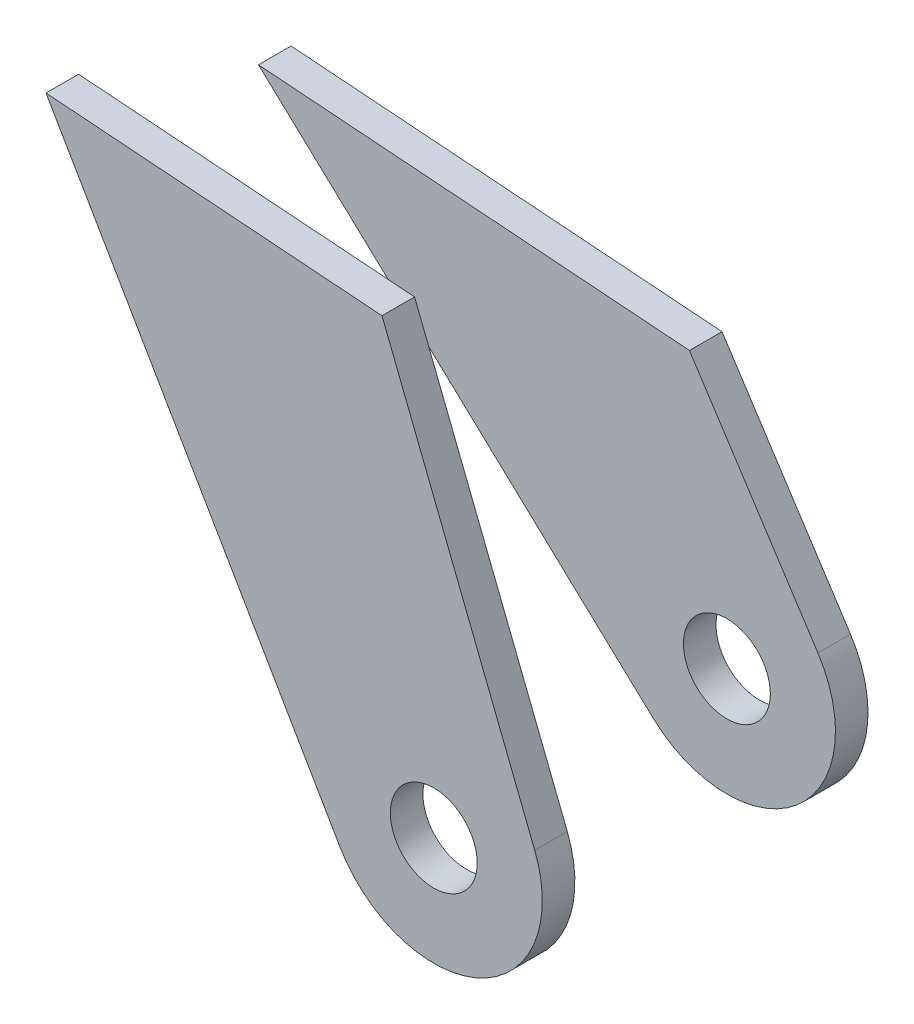
ISO-10303-21;
HEADER;
FILE_DESCRIPTION(('STEP AP214'),'2;1');
FILE_NAME('part.step','',(''),(''),'','','');
FILE_SCHEMA(('AUTOMOTIVE_DESIGN { 1 0 10303 214 1 1 1 1 }'));
ENDSEC;
DATA;
#1=APPLICATION_CONTEXT('core data for automotive mechanical design processes');
#2=APPLICATION_PROTOCOL_DEFINITION('international standard','automotive_design',2000,#1);
#3=PRODUCT_CONTEXT('',#1,'mechanical');
#4=PRODUCT('Part','Part','',(#3));
#5=PRODUCT_RELATED_PRODUCT_CATEGORY('part','',(#4));
#6=PRODUCT_DEFINITION_FORMATION('','',#4);
#7=PRODUCT_DEFINITION_CONTEXT('part definition',#1,'design');
#8=PRODUCT_DEFINITION('design','',#6,#7);
#9=PRODUCT_DEFINITION_SHAPE('','',#8);
#10=(LENGTH_UNIT() NAMED_UNIT(*) SI_UNIT(.MILLI.,.METRE.));
#11=(NAMED_UNIT(*) PLANE_ANGLE_UNIT() SI_UNIT($,.RADIAN.));
#12=(NAMED_UNIT(*) SI_UNIT($,.STERADIAN.) SOLID_ANGLE_UNIT());
#13=UNCERTAINTY_MEASURE_WITH_UNIT(LENGTH_MEASURE(1.E-05),#10,'distance_accuracy_value','');
#14=(GEOMETRIC_REPRESENTATION_CONTEXT(3) GLOBAL_UNCERTAINTY_ASSIGNED_CONTEXT((#13)) GLOBAL_UNIT_ASSIGNED_CONTEXT((#10,
#11,#12)) REPRESENTATION_CONTEXT('',''));
#15=CARTESIAN_POINT('',(0.,0.,0.));
#16=DIRECTION('',(0.,0.,1.));
#17=DIRECTION('',(1.,0.,0.));
#18=AXIS2_PLACEMENT_3D('',#15,#16,#17);
#19=CARTESIAN_POINT('',(0.,0.,206.999999999998));
#20=DIRECTION('',(0.,0.,-1.));
#21=DIRECTION('',(-1.,0.,0.));
#22=AXIS2_PLACEMENT_3D('',#19,#20,#21);
#23=PLANE('',#22);
#24=CARTESIAN_POINT('',(246.,-2201.,206.999999999998));
#25=DIRECTION('',(0.,0.,1.));
#26=DIRECTION('',(1.,0.,0.));
#27=AXIS2_PLACEMENT_3D('',#24,#25,#26);
#28=CIRCLE('',#27,9.99999999999909);
#29=CARTESIAN_POINT('',(239.174999691878,-2208.3088556419,206.999999999998));
#30=VERTEX_POINT('',#29);
#31=CARTESIAN_POINT('',(254.386121568859,-2195.55271030399,206.999999999998));
#32=VERTEX_POINT('',#31);
#33=EDGE_CURVE('E144',#30,#32,#28,.T.);
#34=ORIENTED_EDGE('',*,*,#33,.F.);
#35=DIRECTION('',(-0.730885564189976,0.682500030812234,0.));
#36=VECTOR('',#35,1.);
#37=CARTESIAN_POINT('',(239.174999691878,-2208.3088556419,206.999999999998));
#38=LINE('',#37,#36);
#39=CARTESIAN_POINT('',(202.857907594034,-2174.39600020979,206.999999999998));
#40=VERTEX_POINT('',#39);
#41=EDGE_CURVE('E170',#30,#40,#38,.T.);
#42=ORIENTED_EDGE('',*,*,#41,.T.);
#43=DIRECTION('',(0.99726775445671,-0.0738716855152959,0.));
#44=VECTOR('',#43,1.);
#45=CARTESIAN_POINT('',(202.857907594034,-2174.39600020979,206.999999999998));
#46=LINE('',#45,#44);
#47=CARTESIAN_POINT('',(242.553545388066,-2177.33641782416,206.999999999998));
#48=VERTEX_POINT('',#47);
#49=EDGE_CURVE('E214',#40,#48,#46,.T.);
#50=ORIENTED_EDGE('',*,*,#49,.T.);
#51=DIRECTION('',(0.544728969601438,-0.83861215688598,0.));
#52=VECTOR('',#51,1.);
#53=CARTESIAN_POINT('',(242.553545388066,-2177.33641782416,206.999999999998));
#54=LINE('',#53,#52);
#55=EDGE_CURVE('E176',#48,#32,#54,.T.);
#56=ORIENTED_EDGE('',*,*,#55,.T.);
#57=EDGE_LOOP('',(#34,#42,#50,#56));
#58=FACE_BOUND('',#57,.T.);
#59=CARTESIAN_POINT('',(246.,-2201.,206.999999999998));
#60=DIRECTION('',(0.,0.,1.));
#61=DIRECTION('',(1.,0.,0.));
#62=AXIS2_PLACEMENT_3D('',#59,#60,#61);
#63=CIRCLE('',#62,3.99999999999997);
#64=CARTESIAN_POINT('',(250.,-2201.,206.999999999998));
#65=VERTEX_POINT('',#64);
#66=EDGE_CURVE('E192',#65,#65,#63,.T.);
#67=ORIENTED_EDGE('',*,*,#66,.T.);
#68=EDGE_LOOP('',(#67));
#69=FACE_BOUND('',#68,.T.);
#70=ADVANCED_FACE('F135',(#58,#69),#23,.T.);
#71=CARTESIAN_POINT('',(0.,0.,209.999999999998));
#72=DIRECTION('',(0.,0.,-1.));
#73=DIRECTION('',(-1.,0.,0.));
#74=AXIS2_PLACEMENT_3D('',#71,#72,#73);
#75=PLANE('',#74);
#76=CARTESIAN_POINT('',(246.,-2201.,209.999999999998));
#77=DIRECTION('',(0.,0.,1.));
#78=DIRECTION('',(1.,0.,0.));
#79=AXIS2_PLACEMENT_3D('',#76,#77,#78);
#80=CIRCLE('',#79,9.99999999999909);
#81=CARTESIAN_POINT('',(239.174999691878,-2208.3088556419,209.999999999998));
#82=VERTEX_POINT('',#81);
#83=CARTESIAN_POINT('',(254.386121568859,-2195.55271030399,209.999999999998));
#84=VERTEX_POINT('',#83);
#85=EDGE_CURVE('E13',#82,#84,#80,.T.);
#86=ORIENTED_EDGE('',*,*,#85,.T.);
#87=DIRECTION('',(0.544728969601438,-0.83861215688598,0.));
#88=VECTOR('',#87,1.);
#89=CARTESIAN_POINT('',(242.553545388066,-2177.33641782416,209.999999999998));
#90=LINE('',#89,#88);
#91=CARTESIAN_POINT('',(242.553545388066,-2177.33641782416,209.999999999998));
#92=VERTEX_POINT('',#91);
#93=EDGE_CURVE('E203',#92,#84,#90,.T.);
#94=ORIENTED_EDGE('',*,*,#93,.F.);
#95=DIRECTION('',(0.99726775445671,-0.0738716855152959,0.));
#96=VECTOR('',#95,1.);
#97=CARTESIAN_POINT('',(202.857907594034,-2174.39600020979,209.999999999998));
#98=LINE('',#97,#96);
#99=CARTESIAN_POINT('',(202.857907594034,-2174.39600020979,209.999999999998));
#100=VERTEX_POINT('',#99);
#101=EDGE_CURVE('E209',#100,#92,#98,.T.);
#102=ORIENTED_EDGE('',*,*,#101,.F.);
#103=DIRECTION('',(-0.730885564189976,0.682500030812234,0.));
#104=VECTOR('',#103,1.);
#105=CARTESIAN_POINT('',(239.174999691878,-2208.3088556419,209.999999999998));
#106=LINE('',#105,#104);
#107=EDGE_CURVE('E186',#82,#100,#106,.T.);
#108=ORIENTED_EDGE('',*,*,#107,.F.);
#109=EDGE_LOOP('',(#86,#94,#102,#108));
#110=FACE_BOUND('',#109,.T.);
#111=CARTESIAN_POINT('',(246.,-2201.,209.999999999998));
#112=DIRECTION('',(0.,0.,1.));
#113=DIRECTION('',(1.,0.,0.));
#114=AXIS2_PLACEMENT_3D('',#111,#112,#113);
#115=CIRCLE('',#114,3.99999999999997);
#116=CARTESIAN_POINT('',(250.,-2201.,209.999999999998));
#117=VERTEX_POINT('',#116);
#118=EDGE_CURVE('E195',#117,#117,#115,.T.);
#119=ORIENTED_EDGE('',*,*,#118,.F.);
#120=EDGE_LOOP('',(#119));
#121=FACE_BOUND('',#120,.T.);
#122=ADVANCED_FACE('F234',(#110,#121),#75,.F.);
#123=CARTESIAN_POINT('',(239.174999691878,-2208.3088556419,209.999999999998));
#124=DIRECTION('',(-0.682500030812234,-0.730885564189976,0.));
#125=DIRECTION('',(0.730885564189976,-0.682500030812234,0.));
#126=AXIS2_PLACEMENT_3D('',#123,#124,#125);
#127=PLANE('',#126);
#128=ORIENTED_EDGE('',*,*,#41,.F.);
#129=DIRECTION('',(0.,0.,-1.));
#130=VECTOR('',#129,1.);
#131=CARTESIAN_POINT('',(239.174999691878,-2208.3088556419,209.999999999998));
#132=LINE('',#131,#130);
#133=EDGE_CURVE('E182',#82,#30,#132,.T.);
#134=ORIENTED_EDGE('',*,*,#133,.F.);
#135=ORIENTED_EDGE('',*,*,#107,.T.);
#136=DIRECTION('',(0.,0.,-1.));
#137=VECTOR('',#136,1.);
#138=CARTESIAN_POINT('',(202.857907594034,-2174.39600020979,209.999999999998));
#139=LINE('',#138,#137);
#140=EDGE_CURVE('E190',#100,#40,#139,.T.);
#141=ORIENTED_EDGE('',*,*,#140,.T.);
#142=EDGE_LOOP('',(#128,#134,#135,#141));
#143=FACE_BOUND('',#142,.T.);
#144=ADVANCED_FACE('F188',(#143),#127,.T.);
#145=CARTESIAN_POINT('',(202.857907594034,-2174.39600020979,209.999999999998));
#146=DIRECTION('',(0.0738716855152959,0.99726775445671,0.));
#147=DIRECTION('',(-0.99726775445671,0.0738716855152959,0.));
#148=AXIS2_PLACEMENT_3D('',#145,#146,#147);
#149=PLANE('',#148);
#150=ORIENTED_EDGE('',*,*,#49,.F.);
#151=ORIENTED_EDGE('',*,*,#140,.F.);
#152=ORIENTED_EDGE('',*,*,#101,.T.);
#153=DIRECTION('',(0.,0.,-1.));
#154=VECTOR('',#153,1.);
#155=CARTESIAN_POINT('',(242.553545388066,-2177.33641782416,209.999999999998));
#156=LINE('',#155,#154);
#157=EDGE_CURVE('E204',#92,#48,#156,.T.);
#158=ORIENTED_EDGE('',*,*,#157,.T.);
#159=EDGE_LOOP('',(#150,#151,#152,#158));
#160=FACE_BOUND('',#159,.T.);
#161=ADVANCED_FACE('F237',(#160),#149,.T.);
#162=CARTESIAN_POINT('',(242.553545388066,-2177.33641782416,209.999999999998));
#163=DIRECTION('',(0.83861215688598,0.544728969601438,0.));
#164=DIRECTION('',(-0.544728969601438,0.83861215688598,0.));
#165=AXIS2_PLACEMENT_3D('',#162,#163,#164);
#166=PLANE('',#165);
#167=ORIENTED_EDGE('',*,*,#55,.F.);
#168=ORIENTED_EDGE('',*,*,#157,.F.);
#169=ORIENTED_EDGE('',*,*,#93,.T.);
#170=DIRECTION('',(0.,0.,-1.));
#171=VECTOR('',#170,1.);
#172=CARTESIAN_POINT('',(254.38612156886,-2195.55271030399,209.999999999998));
#173=LINE('',#172,#171);
#174=EDGE_CURVE('E179',#84,#32,#173,.T.);
#175=ORIENTED_EDGE('',*,*,#174,.T.);
#176=EDGE_LOOP('',(#167,#168,#169,#175));
#177=FACE_BOUND('',#176,.T.);
#178=ADVANCED_FACE('F233',(#177),#166,.T.);
#179=CARTESIAN_POINT('',(246.,-2201.,209.999999999998));
#180=DIRECTION('',(0.,0.,-1.));
#181=DIRECTION('',(-1.,0.,0.));
#182=AXIS2_PLACEMENT_3D('',#179,#180,#181);
#183=CYLINDRICAL_SURFACE('',#182,9.99999999999909);
#184=ORIENTED_EDGE('',*,*,#33,.T.);
#185=ORIENTED_EDGE('',*,*,#174,.F.);
#186=ORIENTED_EDGE('',*,*,#85,.F.);
#187=ORIENTED_EDGE('',*,*,#133,.T.);
#188=EDGE_LOOP('',(#184,#185,#186,#187));
#189=FACE_BOUND('',#188,.T.);
#190=ADVANCED_FACE('F183',(#189),#183,.T.);
#191=CARTESIAN_POINT('',(246.,-2201.,209.999999999998));
#192=DIRECTION('',(0.,0.,-1.));
#193=DIRECTION('',(-1.,0.,0.));
#194=AXIS2_PLACEMENT_3D('',#191,#192,#193);
#195=CYLINDRICAL_SURFACE('',#194,3.99999999999997);
#196=ORIENTED_EDGE('',*,*,#118,.T.);
#197=EDGE_LOOP('',(#196));
#198=FACE_BOUND('',#197,.T.);
#199=ORIENTED_EDGE('',*,*,#66,.F.);
#200=EDGE_LOOP('',(#199));
#201=FACE_BOUND('',#200,.T.);
#202=ADVANCED_FACE('F246',(#198,#201),#195,.F.);
#203=CLOSED_SHELL('',(#70,#122,#144,#161,#178,#190,#202));
#204=MANIFOLD_SOLID_BREP('B2',#203);
#205=CARTESIAN_POINT('',(-3.55158651711607E-13,-4.43948314639509E-13,237.000000000084));
#206=DIRECTION('',(0.,0.,1.));
#207=DIRECTION('',(0.,-1.,0.));
#208=AXIS2_PLACEMENT_3D('',#205,#206,#207);
#209=PLANE('',#208);
#210=CARTESIAN_POINT('',(246.,-2201.,237.000000000081));
#211=DIRECTION('',(0.,0.,1.));
#212=DIRECTION('',(1.,0.,0.));
#213=AXIS2_PLACEMENT_3D('',#210,#211,#212);
#214=CIRCLE('',#213,3.99999999999967);
#215=CARTESIAN_POINT('',(250.,-2201.,237.000000000081));
#216=VERTEX_POINT('',#215);
#217=EDGE_CURVE('E360',#216,#216,#214,.T.);
#218=ORIENTED_EDGE('',*,*,#217,.F.);
#219=EDGE_LOOP('',(#218));
#220=FACE_BOUND('',#219,.T.);
#221=DIRECTION('',(-0.50235591799253,0.864660934504319,0.));
#222=VECTOR('',#221,1.);
#223=CARTESIAN_POINT('',(237.353390654958,-2206.02355917992,237.000000000081));
#224=LINE('',#223,#222);
#225=CARTESIAN_POINT('',(237.353390654958,-2206.02355917992,237.000000000081));
#226=VERTEX_POINT('',#225);
#227=CARTESIAN_POINT('',(210.284879759463,-2159.43291878284,237.000000000081));
#228=VERTEX_POINT('',#227);
#229=EDGE_CURVE('E342',#226,#228,#224,.T.);
#230=ORIENTED_EDGE('',*,*,#229,.F.);
#231=CARTESIAN_POINT('',(246.,-2201.,237.000000000081));
#232=DIRECTION('',(0.,0.,1.));
#233=DIRECTION('',(1.,0.,0.));
#234=AXIS2_PLACEMENT_3D('',#231,#232,#233);
#235=CIRCLE('',#234,9.99999999999945);
#236=CARTESIAN_POINT('',(255.299982720152,-2197.32436108889,237.000000000081));
#237=VERTEX_POINT('',#236);
#238=EDGE_CURVE('E313',#226,#237,#235,.T.);
#239=ORIENTED_EDGE('',*,*,#238,.T.);
#240=DIRECTION('',(-0.367563891110974,0.929998272015255,0.));
#241=VECTOR('',#240,1.);
#242=CARTESIAN_POINT('',(255.299982720152,-2197.32436108889,237.000000000081));
#243=LINE('',#242,#241);
#244=CARTESIAN_POINT('',(241.230083117706,-2161.72515606863,237.000000000081));
#245=VERTEX_POINT('',#244);
#246=EDGE_CURVE('E370',#237,#245,#243,.T.);
#247=ORIENTED_EDGE('',*,*,#246,.T.);
#248=DIRECTION('',(0.997267754456711,-0.073871685515293,0.));
#249=VECTOR('',#248,1.);
#250=CARTESIAN_POINT('',(210.284879759463,-2159.43291878284,237.000000000081));
#251=LINE('',#250,#249);
#252=EDGE_CURVE('E359',#228,#245,#251,.T.);
#253=ORIENTED_EDGE('',*,*,#252,.F.);
#254=EDGE_LOOP('',(#230,#239,#247,#253));
#255=FACE_BOUND('',#254,.T.);
#256=ADVANCED_FACE('F304',(#220,#255),#209,.T.);
#257=CARTESIAN_POINT('',(-3.55158651711607E-13,-4.43948314639509E-13,234.000000000084));
#258=DIRECTION('',(0.,0.,1.));
#259=DIRECTION('',(0.,-1.,0.));
#260=AXIS2_PLACEMENT_3D('',#257,#258,#259);
#261=PLANE('',#260);
#262=CARTESIAN_POINT('',(246.,-2201.,234.000000000081));
#263=DIRECTION('',(0.,0.,1.));
#264=DIRECTION('',(1.,0.,0.));
#265=AXIS2_PLACEMENT_3D('',#262,#263,#264);
#266=CIRCLE('',#265,3.99999999999967);
#267=CARTESIAN_POINT('',(250.,-2201.,234.000000000081));
#268=VERTEX_POINT('',#267);
#269=EDGE_CURVE('E363',#268,#268,#266,.T.);
#270=ORIENTED_EDGE('',*,*,#269,.T.);
#271=EDGE_LOOP('',(#270));
#272=FACE_BOUND('',#271,.T.);
#273=DIRECTION('',(-0.50235591799253,0.864660934504319,0.));
#274=VECTOR('',#273,1.);
#275=CARTESIAN_POINT('',(237.353390654958,-2206.02355917992,234.000000000081));
#276=LINE('',#275,#274);
#277=CARTESIAN_POINT('',(237.353390654958,-2206.02355917992,234.000000000081));
#278=VERTEX_POINT('',#277);
#279=CARTESIAN_POINT('',(210.284879759463,-2159.43291878284,234.000000000081));
#280=VERTEX_POINT('',#279);
#281=EDGE_CURVE('E356',#278,#280,#276,.T.);
#282=ORIENTED_EDGE('',*,*,#281,.T.);
#283=DIRECTION('',(0.997267754456711,-0.073871685515293,0.));
#284=VECTOR('',#283,1.);
#285=CARTESIAN_POINT('',(210.284879759463,-2159.43291878284,234.000000000081));
#286=LINE('',#285,#284);
#287=CARTESIAN_POINT('',(241.230083117706,-2161.72515606863,234.000000000081));
#288=VERTEX_POINT('',#287);
#289=EDGE_CURVE('E377',#280,#288,#286,.T.);
#290=ORIENTED_EDGE('',*,*,#289,.T.);
#291=DIRECTION('',(-0.367563891110974,0.929998272015255,0.));
#292=VECTOR('',#291,1.);
#293=CARTESIAN_POINT('',(255.299982720152,-2197.32436108889,234.000000000081));
#294=LINE('',#293,#292);
#295=CARTESIAN_POINT('',(255.299982720152,-2197.32436108889,234.000000000081));
#296=VERTEX_POINT('',#295);
#297=EDGE_CURVE('E352',#296,#288,#294,.T.);
#298=ORIENTED_EDGE('',*,*,#297,.F.);
#299=CARTESIAN_POINT('',(246.,-2201.,234.000000000081));
#300=DIRECTION('',(0.,0.,1.));
#301=DIRECTION('',(1.,0.,0.));
#302=AXIS2_PLACEMENT_3D('',#299,#300,#301);
#303=CIRCLE('',#302,9.99999999999945);
#304=EDGE_CURVE('E133',#278,#296,#303,.T.);
#305=ORIENTED_EDGE('',*,*,#304,.F.);
#306=EDGE_LOOP('',(#282,#290,#298,#305));
#307=FACE_BOUND('',#306,.T.);
#308=ADVANCED_FACE('F404',(#272,#307),#261,.F.);
#309=CARTESIAN_POINT('',(237.353390654958,-2206.02355917992,234.000000000081));
#310=DIRECTION('',(0.864660934504319,0.50235591799253,0.));
#311=DIRECTION('',(-0.50235591799253,0.864660934504319,0.));
#312=AXIS2_PLACEMENT_3D('',#309,#310,#311);
#313=PLANE('',#312);
#314=ORIENTED_EDGE('',*,*,#229,.T.);
#315=DIRECTION('',(0.,0.,1.));
#316=VECTOR('',#315,1.);
#317=CARTESIAN_POINT('',(210.284879759463,-2159.43291878284,234.000000000081));
#318=LINE('',#317,#316);
#319=EDGE_CURVE('E385',#280,#228,#318,.T.);
#320=ORIENTED_EDGE('',*,*,#319,.F.);
#321=ORIENTED_EDGE('',*,*,#281,.F.);
#322=DIRECTION('',(0.,0.,1.));
#323=VECTOR('',#322,1.);
#324=CARTESIAN_POINT('',(237.353390654958,-2206.02355917992,234.000000000081));
#325=LINE('',#324,#323);
#326=EDGE_CURVE('E347',#278,#226,#325,.T.);
#327=ORIENTED_EDGE('',*,*,#326,.T.);
#328=EDGE_LOOP('',(#314,#320,#321,#327));
#329=FACE_BOUND('',#328,.T.);
#330=ADVANCED_FACE('F354',(#329),#313,.F.);
#331=CARTESIAN_POINT('',(210.284879759463,-2159.43291878284,234.000000000081));
#332=DIRECTION('',(-0.073871685515293,-0.99726775445671,0.));
#333=DIRECTION('',(0.997267754456711,-0.073871685515293,0.));
#334=AXIS2_PLACEMENT_3D('',#331,#332,#333);
#335=PLANE('',#334);
#336=ORIENTED_EDGE('',*,*,#252,.T.);
#337=DIRECTION('',(0.,0.,1.));
#338=VECTOR('',#337,1.);
#339=CARTESIAN_POINT('',(241.230083117706,-2161.72515606863,234.000000000081));
#340=LINE('',#339,#338);
#341=EDGE_CURVE('E372',#288,#245,#340,.T.);
#342=ORIENTED_EDGE('',*,*,#341,.F.);
#343=ORIENTED_EDGE('',*,*,#289,.F.);
#344=ORIENTED_EDGE('',*,*,#319,.T.);
#345=EDGE_LOOP('',(#336,#342,#343,#344));
#346=FACE_BOUND('',#345,.T.);
#347=ADVANCED_FACE('F403',(#346),#335,.F.);
#348=CARTESIAN_POINT('',(246.,-2201.,234.000000000081));
#349=DIRECTION('',(0.,0.,1.));
#350=DIRECTION('',(1.,0.,0.));
#351=AXIS2_PLACEMENT_3D('',#348,#349,#350);
#352=CYLINDRICAL_SURFACE('',#351,9.99999999999945);
#353=ORIENTED_EDGE('',*,*,#238,.F.);
#354=ORIENTED_EDGE('',*,*,#326,.F.);
#355=ORIENTED_EDGE('',*,*,#304,.T.);
#356=DIRECTION('',(0.,0.,1.));
#357=VECTOR('',#356,1.);
#358=CARTESIAN_POINT('',(255.299982720152,-2197.32436108889,234.000000000081));
#359=LINE('',#358,#357);
#360=EDGE_CURVE('E349',#296,#237,#359,.T.);
#361=ORIENTED_EDGE('',*,*,#360,.T.);
#362=EDGE_LOOP('',(#353,#354,#355,#361));
#363=FACE_BOUND('',#362,.T.);
#364=ADVANCED_FACE('F346',(#363),#352,.T.);
#365=CARTESIAN_POINT('',(255.299982720152,-2197.32436108889,234.000000000081));
#366=DIRECTION('',(0.929998272015255,0.367563891110974,0.));
#367=DIRECTION('',(-0.367563891110974,0.929998272015255,0.));
#368=AXIS2_PLACEMENT_3D('',#365,#366,#367);
#369=PLANE('',#368);
#370=ORIENTED_EDGE('',*,*,#246,.F.);
#371=ORIENTED_EDGE('',*,*,#360,.F.);
#372=ORIENTED_EDGE('',*,*,#297,.T.);
#373=ORIENTED_EDGE('',*,*,#341,.T.);
#374=EDGE_LOOP('',(#370,#371,#372,#373));
#375=FACE_BOUND('',#374,.T.);
#376=ADVANCED_FACE('F402',(#375),#369,.T.);
#377=CARTESIAN_POINT('',(246.,-2201.,234.000000000081));
#378=DIRECTION('',(0.,0.,1.));
#379=DIRECTION('',(1.,0.,0.));
#380=AXIS2_PLACEMENT_3D('',#377,#378,#379);
#381=CYLINDRICAL_SURFACE('',#380,3.99999999999967);
#382=ORIENTED_EDGE('',*,*,#269,.F.);
#383=EDGE_LOOP('',(#382));
#384=FACE_BOUND('',#383,.T.);
#385=ORIENTED_EDGE('',*,*,#217,.T.);
#386=EDGE_LOOP('',(#385));
#387=FACE_BOUND('',#386,.T.);
#388=ADVANCED_FACE('F413',(#384,#387),#381,.F.);
#389=CLOSED_SHELL('',(#256,#308,#330,#347,#364,#376,#388));
#390=MANIFOLD_SOLID_BREP('B7',#389);
#391=ADVANCED_BREP_SHAPE_REPRESENTATION('',(#18,#204,#390),#14);
#392=SHAPE_DEFINITION_REPRESENTATION(#9,#391);
ENDSEC;
END-ISO-10303-21;
